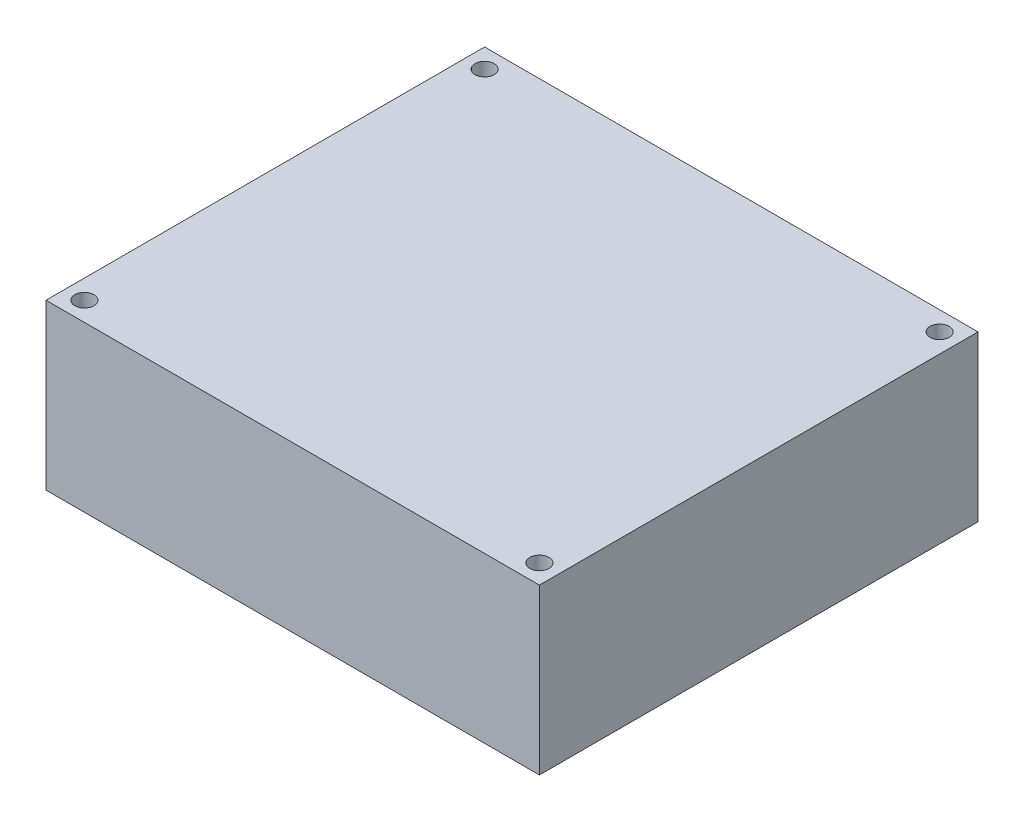
ISO-10303-21;
HEADER;
FILE_DESCRIPTION(('STEP AP214'),'2;1');
FILE_NAME('part.step','',(''),(''),'','','');
FILE_SCHEMA(('AUTOMOTIVE_DESIGN { 1 0 10303 214 1 1 1 1 }'));
ENDSEC;
DATA;
#1=APPLICATION_CONTEXT('core data for automotive mechanical design processes');
#2=APPLICATION_PROTOCOL_DEFINITION('international standard','automotive_design',2000,#1);
#3=PRODUCT_CONTEXT('',#1,'mechanical');
#4=PRODUCT('Part','Part','',(#3));
#5=PRODUCT_RELATED_PRODUCT_CATEGORY('part','',(#4));
#6=PRODUCT_DEFINITION_FORMATION('','',#4);
#7=PRODUCT_DEFINITION_CONTEXT('part definition',#1,'design');
#8=PRODUCT_DEFINITION('design','',#6,#7);
#9=PRODUCT_DEFINITION_SHAPE('','',#8);
#10=(LENGTH_UNIT() NAMED_UNIT(*) SI_UNIT(.MILLI.,.METRE.));
#11=(NAMED_UNIT(*) PLANE_ANGLE_UNIT() SI_UNIT($,.RADIAN.));
#12=(NAMED_UNIT(*) SI_UNIT($,.STERADIAN.) SOLID_ANGLE_UNIT());
#13=UNCERTAINTY_MEASURE_WITH_UNIT(LENGTH_MEASURE(1.E-05),#10,'distance_accuracy_value','');
#14=(GEOMETRIC_REPRESENTATION_CONTEXT(3) GLOBAL_UNCERTAINTY_ASSIGNED_CONTEXT((#13)) GLOBAL_UNIT_ASSIGNED_CONTEXT((#10,
#11,#12)) REPRESENTATION_CONTEXT('',''));
#15=CARTESIAN_POINT('',(0.,0.,0.));
#16=DIRECTION('',(0.,0.,1.));
#17=DIRECTION('',(1.,0.,0.));
#18=AXIS2_PLACEMENT_3D('',#15,#16,#17);
#19=CARTESIAN_POINT('',(0.,30.,0.));
#20=DIRECTION('',(0.,-1.,0.));
#21=DIRECTION('',(0.,0.,-1.));
#22=AXIS2_PLACEMENT_3D('',#19,#20,#21);
#23=PLANE('',#22);
#24=DIRECTION('',(0.,0.,-1.));
#25=VECTOR('',#24,1.);
#26=CARTESIAN_POINT('',(45.,30.,40.));
#27=LINE('',#26,#25);
#28=CARTESIAN_POINT('',(45.,30.,40.));
#29=VERTEX_POINT('',#28);
#30=CARTESIAN_POINT('',(45.,30.,-40.));
#31=VERTEX_POINT('',#30);
#32=EDGE_CURVE('E86',#29,#31,#27,.T.);
#33=ORIENTED_EDGE('',*,*,#32,.T.);
#34=DIRECTION('',(-1.,0.,0.));
#35=VECTOR('',#34,1.);
#36=CARTESIAN_POINT('',(-45.,30.,-40.));
#37=LINE('',#36,#35);
#38=CARTESIAN_POINT('',(-45.,30.,-40.));
#39=VERTEX_POINT('',#38);
#40=EDGE_CURVE('E81',#31,#39,#37,.T.);
#41=ORIENTED_EDGE('',*,*,#40,.T.);
#42=DIRECTION('',(0.,0.,1.));
#43=VECTOR('',#42,1.);
#44=CARTESIAN_POINT('',(-45.,30.,40.));
#45=LINE('',#44,#43);
#46=CARTESIAN_POINT('',(-45.,30.,40.));
#47=VERTEX_POINT('',#46);
#48=EDGE_CURVE('E84',#39,#47,#45,.T.);
#49=ORIENTED_EDGE('',*,*,#48,.T.);
#50=DIRECTION('',(1.,0.,0.));
#51=VECTOR('',#50,1.);
#52=CARTESIAN_POINT('',(-45.,30.,40.));
#53=LINE('',#52,#51);
#54=EDGE_CURVE('E51',#47,#29,#53,.T.);
#55=ORIENTED_EDGE('',*,*,#54,.T.);
#56=EDGE_LOOP('',(#33,#41,#49,#55));
#57=FACE_BOUND('',#56,.T.);
#58=CARTESIAN_POINT('',(-41.5,30.,-36.5));
#59=DIRECTION('',(0.,1.,0.));
#60=DIRECTION('',(0.,0.,1.));
#61=AXIS2_PLACEMENT_3D('',#58,#59,#60);
#62=CIRCLE('',#61,1.75);
#63=CARTESIAN_POINT('',(-41.5,30.,-34.75));
#64=VERTEX_POINT('',#63);
#65=EDGE_CURVE('E101',#64,#64,#62,.T.);
#66=ORIENTED_EDGE('',*,*,#65,.F.);
#67=EDGE_LOOP('',(#66));
#68=FACE_BOUND('',#67,.T.);
#69=CARTESIAN_POINT('',(41.5,30.,-36.5));
#70=DIRECTION('',(0.,1.,0.));
#71=DIRECTION('',(0.,0.,1.));
#72=AXIS2_PLACEMENT_3D('',#69,#70,#71);
#73=CIRCLE('',#72,1.75);
#74=CARTESIAN_POINT('',(41.5,30.,-34.75));
#75=VERTEX_POINT('',#74);
#76=EDGE_CURVE('E116',#75,#75,#73,.T.);
#77=ORIENTED_EDGE('',*,*,#76,.F.);
#78=EDGE_LOOP('',(#77));
#79=FACE_BOUND('',#78,.T.);
#80=CARTESIAN_POINT('',(41.5,30.,36.5));
#81=DIRECTION('',(0.,1.,0.));
#82=DIRECTION('',(0.,0.,1.));
#83=AXIS2_PLACEMENT_3D('',#80,#81,#82);
#84=CIRCLE('',#83,1.75);
#85=CARTESIAN_POINT('',(41.5,30.,38.25));
#86=VERTEX_POINT('',#85);
#87=EDGE_CURVE('E122',#86,#86,#84,.T.);
#88=ORIENTED_EDGE('',*,*,#87,.F.);
#89=EDGE_LOOP('',(#88));
#90=FACE_BOUND('',#89,.T.);
#91=CARTESIAN_POINT('',(-41.5,30.,36.5));
#92=DIRECTION('',(0.,1.,0.));
#93=DIRECTION('',(0.,0.,1.));
#94=AXIS2_PLACEMENT_3D('',#91,#92,#93);
#95=CIRCLE('',#94,1.75);
#96=CARTESIAN_POINT('',(-41.5,30.,38.25));
#97=VERTEX_POINT('',#96);
#98=EDGE_CURVE('E128',#97,#97,#95,.T.);
#99=ORIENTED_EDGE('',*,*,#98,.F.);
#100=EDGE_LOOP('',(#99));
#101=FACE_BOUND('',#100,.T.);
#102=ADVANCED_FACE('F34',(#57,#68,#79,#90,#101),#23,.F.);
#103=CARTESIAN_POINT('',(0.,0.,0.));
#104=DIRECTION('',(0.,-1.,0.));
#105=DIRECTION('',(0.,0.,-1.));
#106=AXIS2_PLACEMENT_3D('',#103,#104,#105);
#107=PLANE('',#106);
#108=CARTESIAN_POINT('',(41.5,0.,36.5));
#109=DIRECTION('',(0.,1.,0.));
#110=DIRECTION('',(0.,0.,1.));
#111=AXIS2_PLACEMENT_3D('',#108,#109,#110);
#112=CIRCLE('',#111,1.75);
#113=CARTESIAN_POINT('',(41.5,0.,38.25));
#114=VERTEX_POINT('',#113);
#115=EDGE_CURVE('E125',#114,#114,#112,.T.);
#116=ORIENTED_EDGE('',*,*,#115,.T.);
#117=EDGE_LOOP('',(#116));
#118=FACE_BOUND('',#117,.T.);
#119=CARTESIAN_POINT('',(-41.5,0.,-36.5));
#120=DIRECTION('',(0.,1.,0.));
#121=DIRECTION('',(0.,0.,1.));
#122=AXIS2_PLACEMENT_3D('',#119,#120,#121);
#123=CIRCLE('',#122,1.75);
#124=CARTESIAN_POINT('',(-41.5,0.,-34.75));
#125=VERTEX_POINT('',#124);
#126=EDGE_CURVE('E113',#125,#125,#123,.T.);
#127=ORIENTED_EDGE('',*,*,#126,.T.);
#128=EDGE_LOOP('',(#127));
#129=FACE_BOUND('',#128,.T.);
#130=DIRECTION('',(0.,0.,-1.));
#131=VECTOR('',#130,1.);
#132=CARTESIAN_POINT('',(45.,0.,40.));
#133=LINE('',#132,#131);
#134=CARTESIAN_POINT('',(45.,0.,40.));
#135=VERTEX_POINT('',#134);
#136=CARTESIAN_POINT('',(45.,0.,-40.));
#137=VERTEX_POINT('',#136);
#138=EDGE_CURVE('E98',#135,#137,#133,.T.);
#139=ORIENTED_EDGE('',*,*,#138,.F.);
#140=DIRECTION('',(1.,0.,0.));
#141=VECTOR('',#140,1.);
#142=CARTESIAN_POINT('',(-45.,0.,40.));
#143=LINE('',#142,#141);
#144=CARTESIAN_POINT('',(-45.,0.,40.));
#145=VERTEX_POINT('',#144);
#146=EDGE_CURVE('E74',#145,#135,#143,.T.);
#147=ORIENTED_EDGE('',*,*,#146,.F.);
#148=DIRECTION('',(0.,0.,1.));
#149=VECTOR('',#148,1.);
#150=CARTESIAN_POINT('',(-45.,0.,40.));
#151=LINE('',#150,#149);
#152=CARTESIAN_POINT('',(-45.,0.,-40.));
#153=VERTEX_POINT('',#152);
#154=EDGE_CURVE('E68',#153,#145,#151,.T.);
#155=ORIENTED_EDGE('',*,*,#154,.F.);
#156=DIRECTION('',(-1.,0.,0.));
#157=VECTOR('',#156,1.);
#158=CARTESIAN_POINT('',(-45.,0.,-40.));
#159=LINE('',#158,#157);
#160=EDGE_CURVE('E90',#137,#153,#159,.T.);
#161=ORIENTED_EDGE('',*,*,#160,.F.);
#162=EDGE_LOOP('',(#139,#147,#155,#161));
#163=FACE_BOUND('',#162,.T.);
#164=CARTESIAN_POINT('',(41.5,0.,-36.5));
#165=DIRECTION('',(0.,1.,0.));
#166=DIRECTION('',(0.,0.,1.));
#167=AXIS2_PLACEMENT_3D('',#164,#165,#166);
#168=CIRCLE('',#167,1.75);
#169=CARTESIAN_POINT('',(41.5,0.,-34.75));
#170=VERTEX_POINT('',#169);
#171=EDGE_CURVE('E119',#170,#170,#168,.T.);
#172=ORIENTED_EDGE('',*,*,#171,.T.);
#173=EDGE_LOOP('',(#172));
#174=FACE_BOUND('',#173,.T.);
#175=CARTESIAN_POINT('',(-41.5,0.,36.5));
#176=DIRECTION('',(0.,1.,0.));
#177=DIRECTION('',(0.,0.,1.));
#178=AXIS2_PLACEMENT_3D('',#175,#176,#177);
#179=CIRCLE('',#178,1.75);
#180=CARTESIAN_POINT('',(-41.5,0.,38.25));
#181=VERTEX_POINT('',#180);
#182=EDGE_CURVE('E131',#181,#181,#179,.T.);
#183=ORIENTED_EDGE('',*,*,#182,.T.);
#184=EDGE_LOOP('',(#183));
#185=FACE_BOUND('',#184,.T.);
#186=ADVANCED_FACE('F109',(#118,#129,#163,#174,#185),#107,.T.);
#187=CARTESIAN_POINT('',(45.,30.,40.));
#188=DIRECTION('',(-1.,0.,0.));
#189=DIRECTION('',(0.,0.,1.));
#190=AXIS2_PLACEMENT_3D('',#187,#188,#189);
#191=PLANE('',#190);
#192=ORIENTED_EDGE('',*,*,#138,.T.);
#193=DIRECTION('',(0.,-1.,0.));
#194=VECTOR('',#193,1.);
#195=CARTESIAN_POINT('',(45.,30.,-40.));
#196=LINE('',#195,#194);
#197=EDGE_CURVE('E11',#31,#137,#196,.T.);
#198=ORIENTED_EDGE('',*,*,#197,.F.);
#199=ORIENTED_EDGE('',*,*,#32,.F.);
#200=DIRECTION('',(0.,-1.,0.));
#201=VECTOR('',#200,1.);
#202=CARTESIAN_POINT('',(45.,30.,40.));
#203=LINE('',#202,#201);
#204=EDGE_CURVE('E94',#29,#135,#203,.T.);
#205=ORIENTED_EDGE('',*,*,#204,.T.);
#206=EDGE_LOOP('',(#192,#198,#199,#205));
#207=FACE_BOUND('',#206,.T.);
#208=ADVANCED_FACE('F36',(#207),#191,.F.);
#209=CARTESIAN_POINT('',(-45.,30.,-40.));
#210=DIRECTION('',(0.,0.,1.));
#211=DIRECTION('',(1.,0.,0.));
#212=AXIS2_PLACEMENT_3D('',#209,#210,#211);
#213=PLANE('',#212);
#214=ORIENTED_EDGE('',*,*,#160,.T.);
#215=DIRECTION('',(0.,-1.,0.));
#216=VECTOR('',#215,1.);
#217=CARTESIAN_POINT('',(-45.,30.,-40.));
#218=LINE('',#217,#216);
#219=EDGE_CURVE('E43',#39,#153,#218,.T.);
#220=ORIENTED_EDGE('',*,*,#219,.F.);
#221=ORIENTED_EDGE('',*,*,#40,.F.);
#222=ORIENTED_EDGE('',*,*,#197,.T.);
#223=EDGE_LOOP('',(#214,#220,#221,#222));
#224=FACE_BOUND('',#223,.T.);
#225=ADVANCED_FACE('F89',(#224),#213,.F.);
#226=CARTESIAN_POINT('',(-45.,30.,40.));
#227=DIRECTION('',(1.,0.,0.));
#228=DIRECTION('',(0.,0.,-1.));
#229=AXIS2_PLACEMENT_3D('',#226,#227,#228);
#230=PLANE('',#229);
#231=ORIENTED_EDGE('',*,*,#154,.T.);
#232=DIRECTION('',(0.,-1.,0.));
#233=VECTOR('',#232,1.);
#234=CARTESIAN_POINT('',(-45.,30.,40.));
#235=LINE('',#234,#233);
#236=EDGE_CURVE('E91',#47,#145,#235,.T.);
#237=ORIENTED_EDGE('',*,*,#236,.F.);
#238=ORIENTED_EDGE('',*,*,#48,.F.);
#239=ORIENTED_EDGE('',*,*,#219,.T.);
#240=EDGE_LOOP('',(#231,#237,#238,#239));
#241=FACE_BOUND('',#240,.T.);
#242=ADVANCED_FACE('F92',(#241),#230,.F.);
#243=CARTESIAN_POINT('',(-45.,30.,40.));
#244=DIRECTION('',(0.,0.,-1.));
#245=DIRECTION('',(-1.,0.,0.));
#246=AXIS2_PLACEMENT_3D('',#243,#244,#245);
#247=PLANE('',#246);
#248=ORIENTED_EDGE('',*,*,#146,.T.);
#249=ORIENTED_EDGE('',*,*,#204,.F.);
#250=ORIENTED_EDGE('',*,*,#54,.F.);
#251=ORIENTED_EDGE('',*,*,#236,.T.);
#252=EDGE_LOOP('',(#248,#249,#250,#251));
#253=FACE_BOUND('',#252,.T.);
#254=ADVANCED_FACE('F106',(#253),#247,.F.);
#255=CARTESIAN_POINT('',(-41.5,30.,-36.5));
#256=DIRECTION('',(0.,-1.,0.));
#257=DIRECTION('',(0.,0.,-1.));
#258=AXIS2_PLACEMENT_3D('',#255,#256,#257);
#259=CYLINDRICAL_SURFACE('',#258,1.75);
#260=ORIENTED_EDGE('',*,*,#65,.T.);
#261=EDGE_LOOP('',(#260));
#262=FACE_BOUND('',#261,.T.);
#263=ORIENTED_EDGE('',*,*,#126,.F.);
#264=EDGE_LOOP('',(#263));
#265=FACE_BOUND('',#264,.T.);
#266=ADVANCED_FACE('F148',(#262,#265),#259,.F.);
#267=CARTESIAN_POINT('',(41.5,30.,-36.5));
#268=DIRECTION('',(0.,-1.,0.));
#269=DIRECTION('',(0.,0.,-1.));
#270=AXIS2_PLACEMENT_3D('',#267,#268,#269);
#271=CYLINDRICAL_SURFACE('',#270,1.75);
#272=ORIENTED_EDGE('',*,*,#76,.T.);
#273=EDGE_LOOP('',(#272));
#274=FACE_BOUND('',#273,.T.);
#275=ORIENTED_EDGE('',*,*,#171,.F.);
#276=EDGE_LOOP('',(#275));
#277=FACE_BOUND('',#276,.T.);
#278=ADVANCED_FACE('F194',(#274,#277),#271,.F.);
#279=CARTESIAN_POINT('',(41.5,30.,36.5));
#280=DIRECTION('',(0.,-1.,0.));
#281=DIRECTION('',(0.,0.,-1.));
#282=AXIS2_PLACEMENT_3D('',#279,#280,#281);
#283=CYLINDRICAL_SURFACE('',#282,1.75);
#284=ORIENTED_EDGE('',*,*,#87,.T.);
#285=EDGE_LOOP('',(#284));
#286=FACE_BOUND('',#285,.T.);
#287=ORIENTED_EDGE('',*,*,#115,.F.);
#288=EDGE_LOOP('',(#287));
#289=FACE_BOUND('',#288,.T.);
#290=ADVANCED_FACE('F202',(#286,#289),#283,.F.);
#291=CARTESIAN_POINT('',(-41.5,30.,36.5));
#292=DIRECTION('',(0.,-1.,0.));
#293=DIRECTION('',(0.,0.,-1.));
#294=AXIS2_PLACEMENT_3D('',#291,#292,#293);
#295=CYLINDRICAL_SURFACE('',#294,1.75);
#296=ORIENTED_EDGE('',*,*,#98,.T.);
#297=EDGE_LOOP('',(#296));
#298=FACE_BOUND('',#297,.T.);
#299=ORIENTED_EDGE('',*,*,#182,.F.);
#300=EDGE_LOOP('',(#299));
#301=FACE_BOUND('',#300,.T.);
#302=ADVANCED_FACE('F137',(#298,#301),#295,.F.);
#303=CLOSED_SHELL('',(#102,#186,#208,#225,#242,#254,#266,#278,#290,#302));
#304=MANIFOLD_SOLID_BREP('B2',#303);
#305=ADVANCED_BREP_SHAPE_REPRESENTATION('',(#18,#304),#14);
#306=SHAPE_DEFINITION_REPRESENTATION(#9,#305);
ENDSEC;
END-ISO-10303-21;
